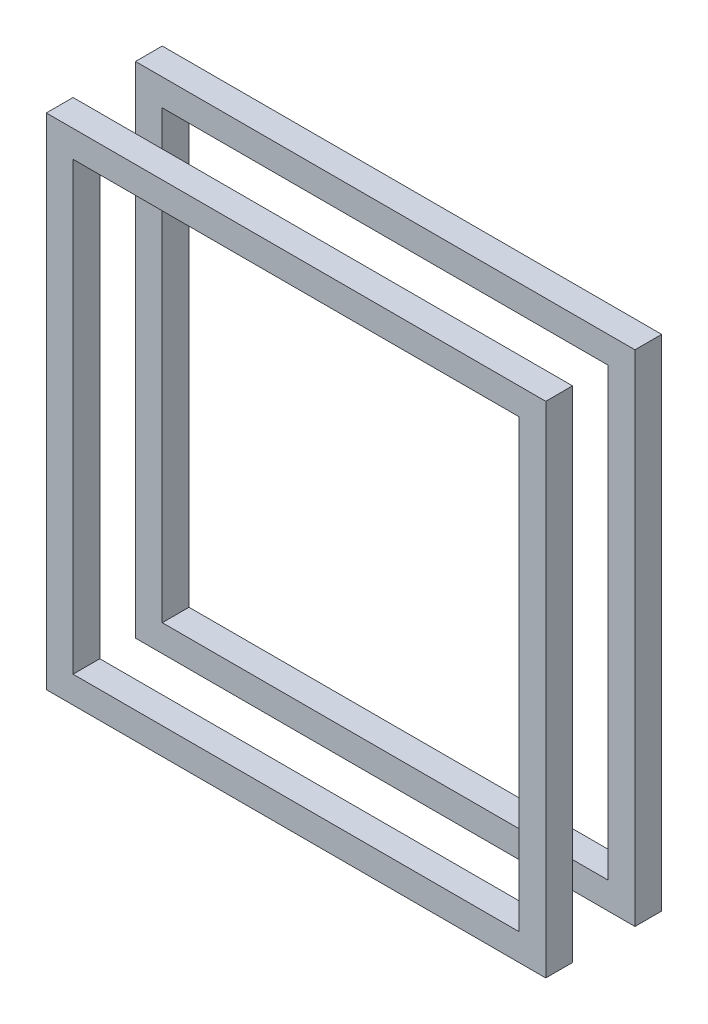
ISO-10303-21;
HEADER;
FILE_DESCRIPTION(('STEP AP214'),'2;1');
FILE_NAME('part.step','',(''),(''),'','','');
FILE_SCHEMA(('AUTOMOTIVE_DESIGN { 1 0 10303 214 1 1 1 1 }'));
ENDSEC;
DATA;
#1=APPLICATION_CONTEXT('core data for automotive mechanical design processes');
#2=APPLICATION_PROTOCOL_DEFINITION('international standard','automotive_design',2000,#1);
#3=PRODUCT_CONTEXT('',#1,'mechanical');
#4=PRODUCT('Part','Part','',(#3));
#5=PRODUCT_RELATED_PRODUCT_CATEGORY('part','',(#4));
#6=PRODUCT_DEFINITION_FORMATION('','',#4);
#7=PRODUCT_DEFINITION_CONTEXT('part definition',#1,'design');
#8=PRODUCT_DEFINITION('design','',#6,#7);
#9=PRODUCT_DEFINITION_SHAPE('','',#8);
#10=(LENGTH_UNIT() NAMED_UNIT(*) SI_UNIT(.MILLI.,.METRE.));
#11=(NAMED_UNIT(*) PLANE_ANGLE_UNIT() SI_UNIT($,.RADIAN.));
#12=(NAMED_UNIT(*) SI_UNIT($,.STERADIAN.) SOLID_ANGLE_UNIT());
#13=UNCERTAINTY_MEASURE_WITH_UNIT(LENGTH_MEASURE(1.E-05),#10,'distance_accuracy_value','');
#14=(GEOMETRIC_REPRESENTATION_CONTEXT(3) GLOBAL_UNCERTAINTY_ASSIGNED_CONTEXT((#13)) GLOBAL_UNIT_ASSIGNED_CONTEXT((#10,
#11,#12)) REPRESENTATION_CONTEXT('',''));
#15=CARTESIAN_POINT('',(0.,0.,0.));
#16=DIRECTION('',(0.,0.,1.));
#17=DIRECTION('',(1.,0.,0.));
#18=AXIS2_PLACEMENT_3D('',#15,#16,#17);
#19=CARTESIAN_POINT('',(0.,0.,-7.));
#20=DIRECTION('',(0.,0.,1.));
#21=DIRECTION('',(1.,0.,0.));
#22=AXIS2_PLACEMENT_3D('',#19,#20,#21);
#23=PLANE('',#22);
#24=DIRECTION('',(1.,0.,0.));
#25=VECTOR('',#24,1.);
#26=CARTESIAN_POINT('',(-28.,-28.,-7.));
#27=LINE('',#26,#25);
#28=CARTESIAN_POINT('',(-28.,-28.,-7.));
#29=VERTEX_POINT('',#28);
#30=CARTESIAN_POINT('',(28.,-28.,-7.));
#31=VERTEX_POINT('',#30);
#32=EDGE_CURVE('E168',#29,#31,#27,.T.);
#33=ORIENTED_EDGE('',*,*,#32,.T.);
#34=DIRECTION('',(0.,1.,0.));
#35=VECTOR('',#34,1.);
#36=CARTESIAN_POINT('',(28.,-28.,-7.));
#37=LINE('',#36,#35);
#38=CARTESIAN_POINT('',(28.,28.,-7.));
#39=VERTEX_POINT('',#38);
#40=EDGE_CURVE('E171',#31,#39,#37,.T.);
#41=ORIENTED_EDGE('',*,*,#40,.T.);
#42=DIRECTION('',(-1.,0.,0.));
#43=VECTOR('',#42,1.);
#44=CARTESIAN_POINT('',(-28.,28.,-7.));
#45=LINE('',#44,#43);
#46=CARTESIAN_POINT('',(-28.,28.,-7.));
#47=VERTEX_POINT('',#46);
#48=EDGE_CURVE('E174',#39,#47,#45,.T.);
#49=ORIENTED_EDGE('',*,*,#48,.T.);
#50=DIRECTION('',(0.,-1.,0.));
#51=VECTOR('',#50,1.);
#52=CARTESIAN_POINT('',(-28.,-28.,-7.));
#53=LINE('',#52,#51);
#54=EDGE_CURVE('E176',#47,#29,#53,.T.);
#55=ORIENTED_EDGE('',*,*,#54,.T.);
#56=EDGE_LOOP('',(#33,#41,#49,#55));
#57=FACE_BOUND('',#56,.T.);
#58=DIRECTION('',(-1.,0.,0.));
#59=VECTOR('',#58,1.);
#60=CARTESIAN_POINT('',(-25.,25.,-7.));
#61=LINE('',#60,#59);
#62=CARTESIAN_POINT('',(25.,25.,-7.));
#63=VERTEX_POINT('',#62);
#64=CARTESIAN_POINT('',(-25.,25.,-7.));
#65=VERTEX_POINT('',#64);
#66=EDGE_CURVE('E140',#63,#65,#61,.T.);
#67=ORIENTED_EDGE('',*,*,#66,.F.);
#68=DIRECTION('',(0.,1.,0.));
#69=VECTOR('',#68,1.);
#70=CARTESIAN_POINT('',(25.,-25.,-7.));
#71=LINE('',#70,#69);
#72=CARTESIAN_POINT('',(25.,-25.,-7.));
#73=VERTEX_POINT('',#72);
#74=EDGE_CURVE('E132',#73,#63,#71,.T.);
#75=ORIENTED_EDGE('',*,*,#74,.F.);
#76=DIRECTION('',(1.,0.,0.));
#77=VECTOR('',#76,1.);
#78=CARTESIAN_POINT('',(-25.,-25.,-7.));
#79=LINE('',#78,#77);
#80=CARTESIAN_POINT('',(-25.,-25.,-7.));
#81=VERTEX_POINT('',#80);
#82=EDGE_CURVE('E154',#81,#73,#79,.T.);
#83=ORIENTED_EDGE('',*,*,#82,.F.);
#84=DIRECTION('',(0.,-1.,0.));
#85=VECTOR('',#84,1.);
#86=CARTESIAN_POINT('',(-25.,-25.,-7.));
#87=LINE('',#86,#85);
#88=EDGE_CURVE('E152',#65,#81,#87,.T.);
#89=ORIENTED_EDGE('',*,*,#88,.F.);
#90=EDGE_LOOP('',(#67,#75,#83,#89));
#91=FACE_BOUND('',#90,.T.);
#92=ADVANCED_FACE('F67',(#57,#91),#23,.T.);
#93=CARTESIAN_POINT('',(0.,0.,-10.));
#94=DIRECTION('',(0.,0.,1.));
#95=DIRECTION('',(1.,0.,0.));
#96=AXIS2_PLACEMENT_3D('',#93,#94,#95);
#97=PLANE('',#96);
#98=DIRECTION('',(1.,0.,0.));
#99=VECTOR('',#98,1.);
#100=CARTESIAN_POINT('',(-28.,-28.,-10.));
#101=LINE('',#100,#99);
#102=CARTESIAN_POINT('',(-28.,-28.,-10.));
#103=VERTEX_POINT('',#102);
#104=CARTESIAN_POINT('',(28.,-28.,-10.));
#105=VERTEX_POINT('',#104);
#106=EDGE_CURVE('E148',#103,#105,#101,.T.);
#107=ORIENTED_EDGE('',*,*,#106,.F.);
#108=DIRECTION('',(0.,-1.,0.));
#109=VECTOR('',#108,1.);
#110=CARTESIAN_POINT('',(-28.,-28.,-10.));
#111=LINE('',#110,#109);
#112=CARTESIAN_POINT('',(-28.,28.,-10.));
#113=VERTEX_POINT('',#112);
#114=EDGE_CURVE('E172',#113,#103,#111,.T.);
#115=ORIENTED_EDGE('',*,*,#114,.F.);
#116=DIRECTION('',(-1.,0.,0.));
#117=VECTOR('',#116,1.);
#118=CARTESIAN_POINT('',(-28.,28.,-10.));
#119=LINE('',#118,#117);
#120=CARTESIAN_POINT('',(28.,28.,-10.));
#121=VERTEX_POINT('',#120);
#122=EDGE_CURVE('E183',#121,#113,#119,.T.);
#123=ORIENTED_EDGE('',*,*,#122,.F.);
#124=DIRECTION('',(0.,1.,0.));
#125=VECTOR('',#124,1.);
#126=CARTESIAN_POINT('',(28.,-28.,-10.));
#127=LINE('',#126,#125);
#128=EDGE_CURVE('E181',#105,#121,#127,.T.);
#129=ORIENTED_EDGE('',*,*,#128,.F.);
#130=EDGE_LOOP('',(#107,#115,#123,#129));
#131=FACE_BOUND('',#130,.T.);
#132=DIRECTION('',(0.,1.,0.));
#133=VECTOR('',#132,1.);
#134=CARTESIAN_POINT('',(25.,-25.,-10.));
#135=LINE('',#134,#133);
#136=CARTESIAN_POINT('',(25.,-25.,-10.));
#137=VERTEX_POINT('',#136);
#138=CARTESIAN_POINT('',(25.,25.,-10.));
#139=VERTEX_POINT('',#138);
#140=EDGE_CURVE('E90',#137,#139,#135,.T.);
#141=ORIENTED_EDGE('',*,*,#140,.T.);
#142=DIRECTION('',(-1.,0.,0.));
#143=VECTOR('',#142,1.);
#144=CARTESIAN_POINT('',(-25.,25.,-10.));
#145=LINE('',#144,#143);
#146=CARTESIAN_POINT('',(-25.,25.,-10.));
#147=VERTEX_POINT('',#146);
#148=EDGE_CURVE('E147',#139,#147,#145,.T.);
#149=ORIENTED_EDGE('',*,*,#148,.T.);
#150=DIRECTION('',(0.,-1.,0.));
#151=VECTOR('',#150,1.);
#152=CARTESIAN_POINT('',(-25.,-25.,-10.));
#153=LINE('',#152,#151);
#154=CARTESIAN_POINT('',(-25.,-25.,-10.));
#155=VERTEX_POINT('',#154);
#156=EDGE_CURVE('E160',#147,#155,#153,.T.);
#157=ORIENTED_EDGE('',*,*,#156,.T.);
#158=DIRECTION('',(1.,0.,0.));
#159=VECTOR('',#158,1.);
#160=CARTESIAN_POINT('',(-25.,-25.,-10.));
#161=LINE('',#160,#159);
#162=EDGE_CURVE('E141',#155,#137,#161,.T.);
#163=ORIENTED_EDGE('',*,*,#162,.T.);
#164=EDGE_LOOP('',(#141,#149,#157,#163));
#165=FACE_BOUND('',#164,.T.);
#166=ADVANCED_FACE('F201',(#131,#165),#97,.F.);
#167=CARTESIAN_POINT('',(-28.,-28.,-7.));
#168=DIRECTION('',(0.,1.,0.));
#169=DIRECTION('',(0.,0.,1.));
#170=AXIS2_PLACEMENT_3D('',#167,#168,#169);
#171=PLANE('',#170);
#172=ORIENTED_EDGE('',*,*,#106,.T.);
#173=DIRECTION('',(0.,0.,-1.));
#174=VECTOR('',#173,1.);
#175=CARTESIAN_POINT('',(28.,-28.,-7.));
#176=LINE('',#175,#174);
#177=EDGE_CURVE('E13',#31,#105,#176,.T.);
#178=ORIENTED_EDGE('',*,*,#177,.F.);
#179=ORIENTED_EDGE('',*,*,#32,.F.);
#180=DIRECTION('',(0.,0.,-1.));
#181=VECTOR('',#180,1.);
#182=CARTESIAN_POINT('',(-28.,-28.,-7.));
#183=LINE('',#182,#181);
#184=EDGE_CURVE('E178',#29,#103,#183,.T.);
#185=ORIENTED_EDGE('',*,*,#184,.T.);
#186=EDGE_LOOP('',(#172,#178,#179,#185));
#187=FACE_BOUND('',#186,.T.);
#188=ADVANCED_FACE('F69',(#187),#171,.F.);
#189=CARTESIAN_POINT('',(28.,-28.,-7.));
#190=DIRECTION('',(-1.,0.,0.));
#191=DIRECTION('',(0.,-1.,0.));
#192=AXIS2_PLACEMENT_3D('',#189,#190,#191);
#193=PLANE('',#192);
#194=ORIENTED_EDGE('',*,*,#128,.T.);
#195=DIRECTION('',(0.,0.,-1.));
#196=VECTOR('',#195,1.);
#197=CARTESIAN_POINT('',(28.,28.,-7.));
#198=LINE('',#197,#196);
#199=EDGE_CURVE('E75',#39,#121,#198,.T.);
#200=ORIENTED_EDGE('',*,*,#199,.F.);
#201=ORIENTED_EDGE('',*,*,#40,.F.);
#202=ORIENTED_EDGE('',*,*,#177,.T.);
#203=EDGE_LOOP('',(#194,#200,#201,#202));
#204=FACE_BOUND('',#203,.T.);
#205=ADVANCED_FACE('F211',(#204),#193,.F.);
#206=CARTESIAN_POINT('',(-28.,28.,-7.));
#207=DIRECTION('',(0.,-1.,0.));
#208=DIRECTION('',(1.,0.,0.));
#209=AXIS2_PLACEMENT_3D('',#206,#207,#208);
#210=PLANE('',#209);
#211=ORIENTED_EDGE('',*,*,#122,.T.);
#212=DIRECTION('',(0.,0.,-1.));
#213=VECTOR('',#212,1.);
#214=CARTESIAN_POINT('',(-28.,28.,-7.));
#215=LINE('',#214,#213);
#216=EDGE_CURVE('E188',#47,#113,#215,.T.);
#217=ORIENTED_EDGE('',*,*,#216,.F.);
#218=ORIENTED_EDGE('',*,*,#48,.F.);
#219=ORIENTED_EDGE('',*,*,#199,.T.);
#220=EDGE_LOOP('',(#211,#217,#218,#219));
#221=FACE_BOUND('',#220,.T.);
#222=ADVANCED_FACE('F195',(#221),#210,.F.);
#223=CARTESIAN_POINT('',(-28.,-28.,-7.));
#224=DIRECTION('',(1.,0.,0.));
#225=DIRECTION('',(0.,0.,-1.));
#226=AXIS2_PLACEMENT_3D('',#223,#224,#225);
#227=PLANE('',#226);
#228=ORIENTED_EDGE('',*,*,#114,.T.);
#229=ORIENTED_EDGE('',*,*,#184,.F.);
#230=ORIENTED_EDGE('',*,*,#54,.F.);
#231=ORIENTED_EDGE('',*,*,#216,.T.);
#232=EDGE_LOOP('',(#228,#229,#230,#231));
#233=FACE_BOUND('',#232,.T.);
#234=ADVANCED_FACE('F205',(#233),#227,.F.);
#235=CARTESIAN_POINT('',(25.,-25.,-7.));
#236=DIRECTION('',(-1.,0.,0.));
#237=DIRECTION('',(0.,0.,1.));
#238=AXIS2_PLACEMENT_3D('',#235,#236,#237);
#239=PLANE('',#238);
#240=ORIENTED_EDGE('',*,*,#140,.F.);
#241=DIRECTION('',(0.,0.,-1.));
#242=VECTOR('',#241,1.);
#243=CARTESIAN_POINT('',(25.,-25.,-7.));
#244=LINE('',#243,#242);
#245=EDGE_CURVE('E136',#73,#137,#244,.T.);
#246=ORIENTED_EDGE('',*,*,#245,.F.);
#247=ORIENTED_EDGE('',*,*,#74,.T.);
#248=DIRECTION('',(0.,0.,-1.));
#249=VECTOR('',#248,1.);
#250=CARTESIAN_POINT('',(25.,25.,-7.));
#251=LINE('',#250,#249);
#252=EDGE_CURVE('E135',#63,#139,#251,.T.);
#253=ORIENTED_EDGE('',*,*,#252,.T.);
#254=EDGE_LOOP('',(#240,#246,#247,#253));
#255=FACE_BOUND('',#254,.T.);
#256=ADVANCED_FACE('F134',(#255),#239,.T.);
#257=CARTESIAN_POINT('',(-25.,25.,-7.));
#258=DIRECTION('',(0.,-1.,0.));
#259=DIRECTION('',(0.,0.,-1.));
#260=AXIS2_PLACEMENT_3D('',#257,#258,#259);
#261=PLANE('',#260);
#262=ORIENTED_EDGE('',*,*,#148,.F.);
#263=ORIENTED_EDGE('',*,*,#252,.F.);
#264=ORIENTED_EDGE('',*,*,#66,.T.);
#265=DIRECTION('',(0.,0.,-1.));
#266=VECTOR('',#265,1.);
#267=CARTESIAN_POINT('',(-25.,25.,-7.));
#268=LINE('',#267,#266);
#269=EDGE_CURVE('E149',#65,#147,#268,.T.);
#270=ORIENTED_EDGE('',*,*,#269,.T.);
#271=EDGE_LOOP('',(#262,#263,#264,#270));
#272=FACE_BOUND('',#271,.T.);
#273=ADVANCED_FACE('F144',(#272),#261,.T.);
#274=CARTESIAN_POINT('',(-25.,-25.,-7.));
#275=DIRECTION('',(1.,0.,0.));
#276=DIRECTION('',(0.,0.,-1.));
#277=AXIS2_PLACEMENT_3D('',#274,#275,#276);
#278=PLANE('',#277);
#279=ORIENTED_EDGE('',*,*,#156,.F.);
#280=ORIENTED_EDGE('',*,*,#269,.F.);
#281=ORIENTED_EDGE('',*,*,#88,.T.);
#282=DIRECTION('',(0.,0.,-1.));
#283=VECTOR('',#282,1.);
#284=CARTESIAN_POINT('',(-25.,-25.,-7.));
#285=LINE('',#284,#283);
#286=EDGE_CURVE('E82',#81,#155,#285,.T.);
#287=ORIENTED_EDGE('',*,*,#286,.T.);
#288=EDGE_LOOP('',(#279,#280,#281,#287));
#289=FACE_BOUND('',#288,.T.);
#290=ADVANCED_FACE('F234',(#289),#278,.T.);
#291=CARTESIAN_POINT('',(-25.,-25.,-7.));
#292=DIRECTION('',(0.,1.,0.));
#293=DIRECTION('',(0.,0.,1.));
#294=AXIS2_PLACEMENT_3D('',#291,#292,#293);
#295=PLANE('',#294);
#296=ORIENTED_EDGE('',*,*,#162,.F.);
#297=ORIENTED_EDGE('',*,*,#286,.F.);
#298=ORIENTED_EDGE('',*,*,#82,.T.);
#299=ORIENTED_EDGE('',*,*,#245,.T.);
#300=EDGE_LOOP('',(#296,#297,#298,#299));
#301=FACE_BOUND('',#300,.T.);
#302=ADVANCED_FACE('F238',(#301),#295,.T.);
#303=CLOSED_SHELL('',(#92,#166,#188,#205,#222,#234,#256,#273,#290,#302));
#304=MANIFOLD_SOLID_BREP('B2',#303);
#305=CARTESIAN_POINT('',(-28.,-28.,3.));
#306=DIRECTION('',(-1.,0.,0.));
#307=DIRECTION('',(0.,0.,1.));
#308=AXIS2_PLACEMENT_3D('',#305,#306,#307);
#309=PLANE('',#308);
#310=DIRECTION('',(0.,1.,0.));
#311=VECTOR('',#310,1.);
#312=CARTESIAN_POINT('',(-28.,-28.,0.));
#313=LINE('',#312,#311);
#314=CARTESIAN_POINT('',(-28.,-28.,0.));
#315=VERTEX_POINT('',#314);
#316=CARTESIAN_POINT('',(-28.,28.,0.));
#317=VERTEX_POINT('',#316);
#318=EDGE_CURVE('E393',#315,#317,#313,.T.);
#319=ORIENTED_EDGE('',*,*,#318,.F.);
#320=DIRECTION('',(0.,0.,-1.));
#321=VECTOR('',#320,1.);
#322=CARTESIAN_POINT('',(-28.,-28.,3.));
#323=LINE('',#322,#321);
#324=CARTESIAN_POINT('',(-28.,-28.,3.));
#325=VERTEX_POINT('',#324);
#326=EDGE_CURVE('E65',#325,#315,#323,.T.);
#327=ORIENTED_EDGE('',*,*,#326,.F.);
#328=DIRECTION('',(0.,1.,0.));
#329=VECTOR('',#328,1.);
#330=CARTESIAN_POINT('',(-28.,-28.,3.));
#331=LINE('',#330,#329);
#332=CARTESIAN_POINT('',(-28.,28.,3.));
#333=VERTEX_POINT('',#332);
#334=EDGE_CURVE('E397',#325,#333,#331,.T.);
#335=ORIENTED_EDGE('',*,*,#334,.T.);
#336=DIRECTION('',(0.,0.,-1.));
#337=VECTOR('',#336,1.);
#338=CARTESIAN_POINT('',(-28.,28.,3.));
#339=LINE('',#338,#337);
#340=EDGE_CURVE('E300',#333,#317,#339,.T.);
#341=ORIENTED_EDGE('',*,*,#340,.T.);
#342=EDGE_LOOP('',(#319,#327,#335,#341));
#343=FACE_BOUND('',#342,.T.);
#344=ADVANCED_FACE('F297',(#343),#309,.T.);
#345=CARTESIAN_POINT('',(-28.,-28.,3.));
#346=DIRECTION('',(0.,1.,0.));
#347=DIRECTION('',(0.,0.,1.));
#348=AXIS2_PLACEMENT_3D('',#345,#346,#347);
#349=PLANE('',#348);
#350=DIRECTION('',(1.,0.,0.));
#351=VECTOR('',#350,1.);
#352=CARTESIAN_POINT('',(-28.,-28.,0.));
#353=LINE('',#352,#351);
#354=CARTESIAN_POINT('',(28.,-28.,0.));
#355=VERTEX_POINT('',#354);
#356=EDGE_CURVE('E401',#315,#355,#353,.T.);
#357=ORIENTED_EDGE('',*,*,#356,.T.);
#358=DIRECTION('',(0.,0.,-1.));
#359=VECTOR('',#358,1.);
#360=CARTESIAN_POINT('',(28.,-28.,3.));
#361=LINE('',#360,#359);
#362=CARTESIAN_POINT('',(28.,-28.,3.));
#363=VERTEX_POINT('',#362);
#364=EDGE_CURVE('E305',#363,#355,#361,.T.);
#365=ORIENTED_EDGE('',*,*,#364,.F.);
#366=DIRECTION('',(1.,0.,0.));
#367=VECTOR('',#366,1.);
#368=CARTESIAN_POINT('',(-28.,-28.,3.));
#369=LINE('',#368,#367);
#370=EDGE_CURVE('E406',#325,#363,#369,.T.);
#371=ORIENTED_EDGE('',*,*,#370,.F.);
#372=ORIENTED_EDGE('',*,*,#326,.T.);
#373=EDGE_LOOP('',(#357,#365,#371,#372));
#374=FACE_BOUND('',#373,.T.);
#375=ADVANCED_FACE('F433',(#374),#349,.F.);
#376=CARTESIAN_POINT('',(28.,-28.,3.));
#377=DIRECTION('',(-1.,0.,0.));
#378=DIRECTION('',(0.,-1.,0.));
#379=AXIS2_PLACEMENT_3D('',#376,#377,#378);
#380=PLANE('',#379);
#381=DIRECTION('',(0.,1.,0.));
#382=VECTOR('',#381,1.);
#383=CARTESIAN_POINT('',(28.,-28.,0.));
#384=LINE('',#383,#382);
#385=CARTESIAN_POINT('',(28.,28.,0.));
#386=VERTEX_POINT('',#385);
#387=EDGE_CURVE('E413',#355,#386,#384,.T.);
#388=ORIENTED_EDGE('',*,*,#387,.T.);
#389=DIRECTION('',(0.,0.,-1.));
#390=VECTOR('',#389,1.);
#391=CARTESIAN_POINT('',(28.,28.,3.));
#392=LINE('',#391,#390);
#393=CARTESIAN_POINT('',(28.,28.,3.));
#394=VERTEX_POINT('',#393);
#395=EDGE_CURVE('E418',#394,#386,#392,.T.);
#396=ORIENTED_EDGE('',*,*,#395,.F.);
#397=DIRECTION('',(0.,1.,0.));
#398=VECTOR('',#397,1.);
#399=CARTESIAN_POINT('',(28.,-28.,3.));
#400=LINE('',#399,#398);
#401=EDGE_CURVE('E404',#363,#394,#400,.T.);
#402=ORIENTED_EDGE('',*,*,#401,.F.);
#403=ORIENTED_EDGE('',*,*,#364,.T.);
#404=EDGE_LOOP('',(#388,#396,#402,#403));
#405=FACE_BOUND('',#404,.T.);
#406=ADVANCED_FACE('F437',(#405),#380,.F.);
#407=CARTESIAN_POINT('',(-28.,28.,3.));
#408=DIRECTION('',(0.,1.,0.));
#409=DIRECTION('',(-1.,0.,0.));
#410=AXIS2_PLACEMENT_3D('',#407,#408,#409);
#411=PLANE('',#410);
#412=DIRECTION('',(1.,0.,0.));
#413=VECTOR('',#412,1.);
#414=CARTESIAN_POINT('',(-28.,28.,0.));
#415=LINE('',#414,#413);
#416=EDGE_CURVE('E410',#317,#386,#415,.T.);
#417=ORIENTED_EDGE('',*,*,#416,.F.);
#418=ORIENTED_EDGE('',*,*,#340,.F.);
#419=DIRECTION('',(1.,0.,0.));
#420=VECTOR('',#419,1.);
#421=CARTESIAN_POINT('',(-28.,28.,3.));
#422=LINE('',#421,#420);
#423=EDGE_CURVE('E400',#333,#394,#422,.T.);
#424=ORIENTED_EDGE('',*,*,#423,.T.);
#425=ORIENTED_EDGE('',*,*,#395,.T.);
#426=EDGE_LOOP('',(#417,#418,#424,#425));
#427=FACE_BOUND('',#426,.T.);
#428=ADVANCED_FACE('F426',(#427),#411,.T.);
#429=CARTESIAN_POINT('',(0.,0.,3.));
#430=DIRECTION('',(0.,0.,-1.));
#431=DIRECTION('',(-1.,0.,0.));
#432=AXIS2_PLACEMENT_3D('',#429,#430,#431);
#433=PLANE('',#432);
#434=DIRECTION('',(1.,0.,0.));
#435=VECTOR('',#434,1.);
#436=CARTESIAN_POINT('',(-25.,-25.,3.));
#437=LINE('',#436,#435);
#438=CARTESIAN_POINT('',(-25.,-25.,3.));
#439=VERTEX_POINT('',#438);
#440=CARTESIAN_POINT('',(25.,-25.,3.));
#441=VERTEX_POINT('',#440);
#442=EDGE_CURVE('E367',#439,#441,#437,.T.);
#443=ORIENTED_EDGE('',*,*,#442,.F.);
#444=DIRECTION('',(0.,1.,0.));
#445=VECTOR('',#444,1.);
#446=CARTESIAN_POINT('',(-25.,-25.,3.));
#447=LINE('',#446,#445);
#448=CARTESIAN_POINT('',(-25.,25.,3.));
#449=VERTEX_POINT('',#448);
#450=EDGE_CURVE('E364',#439,#449,#447,.T.);
#451=ORIENTED_EDGE('',*,*,#450,.T.);
#452=DIRECTION('',(1.,0.,0.));
#453=VECTOR('',#452,1.);
#454=CARTESIAN_POINT('',(-25.,25.,3.));
#455=LINE('',#454,#453);
#456=CARTESIAN_POINT('',(25.,25.,3.));
#457=VERTEX_POINT('',#456);
#458=EDGE_CURVE('E370',#449,#457,#455,.T.);
#459=ORIENTED_EDGE('',*,*,#458,.T.);
#460=DIRECTION('',(0.,1.,0.));
#461=VECTOR('',#460,1.);
#462=CARTESIAN_POINT('',(25.,-25.,3.));
#463=LINE('',#462,#461);
#464=EDGE_CURVE('E374',#441,#457,#463,.T.);
#465=ORIENTED_EDGE('',*,*,#464,.F.);
#466=EDGE_LOOP('',(#443,#451,#459,#465));
#467=FACE_BOUND('',#466,.T.);
#468=ORIENTED_EDGE('',*,*,#334,.F.);
#469=ORIENTED_EDGE('',*,*,#370,.T.);
#470=ORIENTED_EDGE('',*,*,#401,.T.);
#471=ORIENTED_EDGE('',*,*,#423,.F.);
#472=EDGE_LOOP('',(#468,#469,#470,#471));
#473=FACE_BOUND('',#472,.T.);
#474=ADVANCED_FACE('F376',(#467,#473),#433,.F.);
#475=CARTESIAN_POINT('',(0.,0.,0.));
#476=DIRECTION('',(0.,0.,-1.));
#477=DIRECTION('',(-1.,0.,0.));
#478=AXIS2_PLACEMENT_3D('',#475,#476,#477);
#479=PLANE('',#478);
#480=DIRECTION('',(0.,1.,0.));
#481=VECTOR('',#480,1.);
#482=CARTESIAN_POINT('',(-25.,-25.,0.));
#483=LINE('',#482,#481);
#484=CARTESIAN_POINT('',(-25.,-25.,0.));
#485=VERTEX_POINT('',#484);
#486=CARTESIAN_POINT('',(-25.,25.,0.));
#487=VERTEX_POINT('',#486);
#488=EDGE_CURVE('E321',#485,#487,#483,.T.);
#489=ORIENTED_EDGE('',*,*,#488,.F.);
#490=DIRECTION('',(1.,0.,0.));
#491=VECTOR('',#490,1.);
#492=CARTESIAN_POINT('',(-25.,-25.,0.));
#493=LINE('',#492,#491);
#494=CARTESIAN_POINT('',(25.,-25.,0.));
#495=VERTEX_POINT('',#494);
#496=EDGE_CURVE('E378',#485,#495,#493,.T.);
#497=ORIENTED_EDGE('',*,*,#496,.T.);
#498=DIRECTION('',(0.,1.,0.));
#499=VECTOR('',#498,1.);
#500=CARTESIAN_POINT('',(25.,-25.,0.));
#501=LINE('',#500,#499);
#502=CARTESIAN_POINT('',(25.,25.,0.));
#503=VERTEX_POINT('',#502);
#504=EDGE_CURVE('E381',#495,#503,#501,.T.);
#505=ORIENTED_EDGE('',*,*,#504,.T.);
#506=DIRECTION('',(1.,0.,0.));
#507=VECTOR('',#506,1.);
#508=CARTESIAN_POINT('',(-25.,25.,0.));
#509=LINE('',#508,#507);
#510=EDGE_CURVE('E387',#487,#503,#509,.T.);
#511=ORIENTED_EDGE('',*,*,#510,.F.);
#512=EDGE_LOOP('',(#489,#497,#505,#511));
#513=FACE_BOUND('',#512,.T.);
#514=ORIENTED_EDGE('',*,*,#318,.T.);
#515=ORIENTED_EDGE('',*,*,#416,.T.);
#516=ORIENTED_EDGE('',*,*,#387,.F.);
#517=ORIENTED_EDGE('',*,*,#356,.F.);
#518=EDGE_LOOP('',(#514,#515,#516,#517));
#519=FACE_BOUND('',#518,.T.);
#520=ADVANCED_FACE('F430',(#513,#519),#479,.T.);
#521=CARTESIAN_POINT('',(-25.,-25.,3.));
#522=DIRECTION('',(-1.,0.,0.));
#523=DIRECTION('',(0.,0.,1.));
#524=AXIS2_PLACEMENT_3D('',#521,#522,#523);
#525=PLANE('',#524);
#526=ORIENTED_EDGE('',*,*,#488,.T.);
#527=DIRECTION('',(0.,0.,-1.));
#528=VECTOR('',#527,1.);
#529=CARTESIAN_POINT('',(-25.,25.,3.));
#530=LINE('',#529,#528);
#531=EDGE_CURVE('E361',#449,#487,#530,.T.);
#532=ORIENTED_EDGE('',*,*,#531,.F.);
#533=ORIENTED_EDGE('',*,*,#450,.F.);
#534=DIRECTION('',(0.,0.,-1.));
#535=VECTOR('',#534,1.);
#536=CARTESIAN_POINT('',(-25.,-25.,3.));
#537=LINE('',#536,#535);
#538=EDGE_CURVE('E391',#439,#485,#537,.T.);
#539=ORIENTED_EDGE('',*,*,#538,.T.);
#540=EDGE_LOOP('',(#526,#532,#533,#539));
#541=FACE_BOUND('',#540,.T.);
#542=ADVANCED_FACE('F362',(#541),#525,.F.);
#543=CARTESIAN_POINT('',(-25.,-25.,3.));
#544=DIRECTION('',(0.,1.,0.));
#545=DIRECTION('',(0.,0.,1.));
#546=AXIS2_PLACEMENT_3D('',#543,#544,#545);
#547=PLANE('',#546);
#548=ORIENTED_EDGE('',*,*,#496,.F.);
#549=ORIENTED_EDGE('',*,*,#538,.F.);
#550=ORIENTED_EDGE('',*,*,#442,.T.);
#551=DIRECTION('',(0.,0.,-1.));
#552=VECTOR('',#551,1.);
#553=CARTESIAN_POINT('',(25.,-25.,3.));
#554=LINE('',#553,#552);
#555=EDGE_CURVE('E394',#441,#495,#554,.T.);
#556=ORIENTED_EDGE('',*,*,#555,.T.);
#557=EDGE_LOOP('',(#548,#549,#550,#556));
#558=FACE_BOUND('',#557,.T.);
#559=ADVANCED_FACE('F481',(#558),#547,.T.);
#560=CARTESIAN_POINT('',(25.,-25.,3.));
#561=DIRECTION('',(-1.,0.,0.));
#562=DIRECTION('',(0.,0.,1.));
#563=AXIS2_PLACEMENT_3D('',#560,#561,#562);
#564=PLANE('',#563);
#565=ORIENTED_EDGE('',*,*,#504,.F.);
#566=ORIENTED_EDGE('',*,*,#555,.F.);
#567=ORIENTED_EDGE('',*,*,#464,.T.);
#568=DIRECTION('',(0.,0.,-1.));
#569=VECTOR('',#568,1.);
#570=CARTESIAN_POINT('',(25.,25.,3.));
#571=LINE('',#570,#569);
#572=EDGE_CURVE('E313',#457,#503,#571,.T.);
#573=ORIENTED_EDGE('',*,*,#572,.T.);
#574=EDGE_LOOP('',(#565,#566,#567,#573));
#575=FACE_BOUND('',#574,.T.);
#576=ADVANCED_FACE('F489',(#575),#564,.T.);
#577=CARTESIAN_POINT('',(-25.,25.,3.));
#578=DIRECTION('',(0.,1.,0.));
#579=DIRECTION('',(0.,0.,1.));
#580=AXIS2_PLACEMENT_3D('',#577,#578,#579);
#581=PLANE('',#580);
#582=ORIENTED_EDGE('',*,*,#510,.T.);
#583=ORIENTED_EDGE('',*,*,#572,.F.);
#584=ORIENTED_EDGE('',*,*,#458,.F.);
#585=ORIENTED_EDGE('',*,*,#531,.T.);
#586=EDGE_LOOP('',(#582,#583,#584,#585));
#587=FACE_BOUND('',#586,.T.);
#588=ADVANCED_FACE('F371',(#587),#581,.F.);
#589=CLOSED_SHELL('',(#344,#375,#406,#428,#474,#520,#542,#559,#576,#588));
#590=MANIFOLD_SOLID_BREP('B7',#589);
#591=ADVANCED_BREP_SHAPE_REPRESENTATION('',(#18,#304,#590),#14);
#592=SHAPE_DEFINITION_REPRESENTATION(#9,#591);
ENDSEC;
END-ISO-10303-21;
